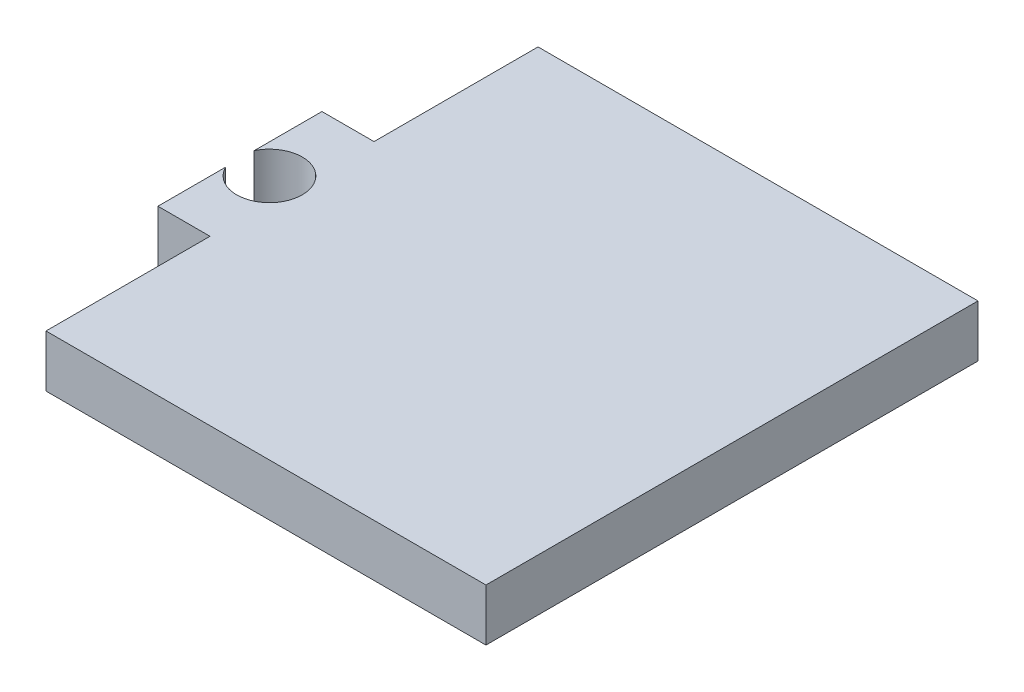
ISO-10303-21;
HEADER;
FILE_DESCRIPTION(('STEP AP214'),'2;1');
FILE_NAME('part.step','',(''),(''),'','','');
FILE_SCHEMA(('AUTOMOTIVE_DESIGN { 1 0 10303 214 1 1 1 1 }'));
ENDSEC;
DATA;
#1=APPLICATION_CONTEXT('core data for automotive mechanical design processes');
#2=APPLICATION_PROTOCOL_DEFINITION('international standard','automotive_design',2000,#1);
#3=PRODUCT_CONTEXT('',#1,'mechanical');
#4=PRODUCT('Part','Part','',(#3));
#5=PRODUCT_RELATED_PRODUCT_CATEGORY('part','',(#4));
#6=PRODUCT_DEFINITION_FORMATION('','',#4);
#7=PRODUCT_DEFINITION_CONTEXT('part definition',#1,'design');
#8=PRODUCT_DEFINITION('design','',#6,#7);
#9=PRODUCT_DEFINITION_SHAPE('','',#8);
#10=(LENGTH_UNIT() NAMED_UNIT(*) SI_UNIT(.MILLI.,.METRE.));
#11=(NAMED_UNIT(*) PLANE_ANGLE_UNIT() SI_UNIT($,.RADIAN.));
#12=(NAMED_UNIT(*) SI_UNIT($,.STERADIAN.) SOLID_ANGLE_UNIT());
#13=UNCERTAINTY_MEASURE_WITH_UNIT(LENGTH_MEASURE(1.E-05),#10,'distance_accuracy_value','');
#14=(GEOMETRIC_REPRESENTATION_CONTEXT(3) GLOBAL_UNCERTAINTY_ASSIGNED_CONTEXT((#13)) GLOBAL_UNIT_ASSIGNED_CONTEXT((#10,
#11,#12)) REPRESENTATION_CONTEXT('',''));
#15=CARTESIAN_POINT('',(0.,0.,0.));
#16=DIRECTION('',(0.,0.,1.));
#17=DIRECTION('',(1.,0.,0.));
#18=AXIS2_PLACEMENT_3D('',#15,#16,#17);
#19=CARTESIAN_POINT('',(3.175,3.175,-30.));
#20=DIRECTION('',(0.,0.,-1.));
#21=DIRECTION('',(-1.,0.,0.));
#22=AXIS2_PLACEMENT_3D('',#19,#20,#21);
#23=PLANE('',#22);
#24=DIRECTION('',(1.,0.,0.));
#25=VECTOR('',#24,1.);
#26=CARTESIAN_POINT('',(3.175,0.,-30.));
#27=LINE('',#26,#25);
#28=CARTESIAN_POINT('',(3.175,0.,-30.));
#29=VERTEX_POINT('',#28);
#30=CARTESIAN_POINT('',(30.,0.,-30.));
#31=VERTEX_POINT('',#30);
#32=EDGE_CURVE('E142',#29,#31,#27,.T.);
#33=ORIENTED_EDGE('',*,*,#32,.F.);
#34=DIRECTION('',(0.,-1.,0.));
#35=VECTOR('',#34,1.);
#36=CARTESIAN_POINT('',(3.175,3.175,-30.));
#37=LINE('',#36,#35);
#38=CARTESIAN_POINT('',(3.175,3.175,-30.));
#39=VERTEX_POINT('',#38);
#40=EDGE_CURVE('E11',#39,#29,#37,.T.);
#41=ORIENTED_EDGE('',*,*,#40,.F.);
#42=DIRECTION('',(1.,0.,0.));
#43=VECTOR('',#42,1.);
#44=CARTESIAN_POINT('',(3.175,3.175,-30.));
#45=LINE('',#44,#43);
#46=CARTESIAN_POINT('',(30.,3.175,-30.));
#47=VERTEX_POINT('',#46);
#48=EDGE_CURVE('E166',#39,#47,#45,.T.);
#49=ORIENTED_EDGE('',*,*,#48,.T.);
#50=DIRECTION('',(0.,-1.,0.));
#51=VECTOR('',#50,1.);
#52=CARTESIAN_POINT('',(30.,3.175,-30.));
#53=LINE('',#52,#51);
#54=EDGE_CURVE('E36',#47,#31,#53,.T.);
#55=ORIENTED_EDGE('',*,*,#54,.T.);
#56=EDGE_LOOP('',(#33,#41,#49,#55));
#57=FACE_BOUND('',#56,.T.);
#58=ADVANCED_FACE('F33',(#57),#23,.T.);
#59=CARTESIAN_POINT('',(3.175,3.175,-30.));
#60=DIRECTION('',(1.,0.,0.));
#61=DIRECTION('',(0.,0.,-1.));
#62=AXIS2_PLACEMENT_3D('',#59,#60,#61);
#63=PLANE('',#62);
#64=DIRECTION('',(0.,0.,1.));
#65=VECTOR('',#64,1.);
#66=CARTESIAN_POINT('',(3.175,0.,-30.));
#67=LINE('',#66,#65);
#68=CARTESIAN_POINT('',(3.175,0.,-20.));
#69=VERTEX_POINT('',#68);
#70=EDGE_CURVE('E165',#29,#69,#67,.T.);
#71=ORIENTED_EDGE('',*,*,#70,.T.);
#72=DIRECTION('',(0.,-1.,0.));
#73=VECTOR('',#72,1.);
#74=CARTESIAN_POINT('',(3.175,3.175,-20.));
#75=LINE('',#74,#73);
#76=CARTESIAN_POINT('',(3.175,3.175,-20.));
#77=VERTEX_POINT('',#76);
#78=EDGE_CURVE('E42',#77,#69,#75,.T.);
#79=ORIENTED_EDGE('',*,*,#78,.F.);
#80=DIRECTION('',(0.,0.,1.));
#81=VECTOR('',#80,1.);
#82=CARTESIAN_POINT('',(3.175,3.175,-30.));
#83=LINE('',#82,#81);
#84=EDGE_CURVE('E132',#39,#77,#83,.T.);
#85=ORIENTED_EDGE('',*,*,#84,.F.);
#86=ORIENTED_EDGE('',*,*,#40,.T.);
#87=EDGE_LOOP('',(#71,#79,#85,#86));
#88=FACE_BOUND('',#87,.T.);
#89=ADVANCED_FACE('F186',(#88),#63,.F.);
#90=CARTESIAN_POINT('',(0.,3.175,-20.));
#91=DIRECTION('',(0.,0.,-1.));
#92=DIRECTION('',(-1.,0.,0.));
#93=AXIS2_PLACEMENT_3D('',#90,#91,#92);
#94=PLANE('',#93);
#95=DIRECTION('',(1.,0.,0.));
#96=VECTOR('',#95,1.);
#97=CARTESIAN_POINT('',(0.,0.,-20.));
#98=LINE('',#97,#96);
#99=CARTESIAN_POINT('',(0.,0.,-20.));
#100=VERTEX_POINT('',#99);
#101=EDGE_CURVE('E120',#100,#69,#98,.T.);
#102=ORIENTED_EDGE('',*,*,#101,.F.);
#103=DIRECTION('',(0.,-1.,0.));
#104=VECTOR('',#103,1.);
#105=CARTESIAN_POINT('',(0.,3.175,-20.));
#106=LINE('',#105,#104);
#107=CARTESIAN_POINT('',(0.,3.175,-20.));
#108=VERTEX_POINT('',#107);
#109=EDGE_CURVE('E115',#108,#100,#106,.T.);
#110=ORIENTED_EDGE('',*,*,#109,.F.);
#111=DIRECTION('',(1.,0.,0.));
#112=VECTOR('',#111,1.);
#113=CARTESIAN_POINT('',(0.,3.175,-20.));
#114=LINE('',#113,#112);
#115=EDGE_CURVE('E118',#108,#77,#114,.T.);
#116=ORIENTED_EDGE('',*,*,#115,.T.);
#117=ORIENTED_EDGE('',*,*,#78,.T.);
#118=EDGE_LOOP('',(#102,#110,#116,#117));
#119=FACE_BOUND('',#118,.T.);
#120=ADVANCED_FACE('F117',(#119),#94,.T.);
#121=CARTESIAN_POINT('',(0.,3.175,-15.8717797887081));
#122=DIRECTION('',(-1.,0.,0.));
#123=DIRECTION('',(0.,0.,1.));
#124=AXIS2_PLACEMENT_3D('',#121,#122,#123);
#125=PLANE('',#124);
#126=DIRECTION('',(0.,0.,-1.));
#127=VECTOR('',#126,1.);
#128=CARTESIAN_POINT('',(0.,0.,-15.8717797887081));
#129=LINE('',#128,#127);
#130=CARTESIAN_POINT('',(0.,0.,-15.8717797887081));
#131=VERTEX_POINT('',#130);
#132=EDGE_CURVE('E162',#131,#100,#129,.T.);
#133=ORIENTED_EDGE('',*,*,#132,.F.);
#134=DIRECTION('',(0.,-1.,0.));
#135=VECTOR('',#134,1.);
#136=CARTESIAN_POINT('',(0.,3.175,-15.8717797887081));
#137=LINE('',#136,#135);
#138=CARTESIAN_POINT('',(0.,3.175,-15.8717797887081));
#139=VERTEX_POINT('',#138);
#140=EDGE_CURVE('E125',#139,#131,#137,.T.);
#141=ORIENTED_EDGE('',*,*,#140,.F.);
#142=DIRECTION('',(0.,0.,-1.));
#143=VECTOR('',#142,1.);
#144=CARTESIAN_POINT('',(0.,3.175,-15.8717797887081));
#145=LINE('',#144,#143);
#146=EDGE_CURVE('E130',#139,#108,#145,.T.);
#147=ORIENTED_EDGE('',*,*,#146,.T.);
#148=ORIENTED_EDGE('',*,*,#109,.T.);
#149=EDGE_LOOP('',(#133,#141,#147,#148));
#150=FACE_BOUND('',#149,.T.);
#151=ADVANCED_FACE('F134',(#150),#125,.T.);
#152=CARTESIAN_POINT('',(1.8,3.175,-15.));
#153=DIRECTION('',(0.,-1.,0.));
#154=DIRECTION('',(0.,0.,-1.));
#155=AXIS2_PLACEMENT_3D('',#152,#153,#154);
#156=CYLINDRICAL_SURFACE('',#155,2.);
#157=CARTESIAN_POINT('',(1.8,0.,-15.));
#158=DIRECTION('',(0.,1.,0.));
#159=DIRECTION('',(0.,0.,1.));
#160=AXIS2_PLACEMENT_3D('',#157,#158,#159);
#161=CIRCLE('',#160,2.);
#162=CARTESIAN_POINT('',(0.,0.,-14.1282202112919));
#163=VERTEX_POINT('',#162);
#164=EDGE_CURVE('E159',#163,#131,#161,.T.);
#165=ORIENTED_EDGE('',*,*,#164,.F.);
#166=DIRECTION('',(0.,-1.,0.));
#167=VECTOR('',#166,1.);
#168=CARTESIAN_POINT('',(0.,3.175,-14.1282202112919));
#169=LINE('',#168,#167);
#170=CARTESIAN_POINT('',(0.,3.175,-14.1282202112919));
#171=VERTEX_POINT('',#170);
#172=EDGE_CURVE('E170',#171,#163,#169,.T.);
#173=ORIENTED_EDGE('',*,*,#172,.F.);
#174=CARTESIAN_POINT('',(1.8,3.175,-15.));
#175=DIRECTION('',(0.,1.,0.));
#176=DIRECTION('',(0.,0.,1.));
#177=AXIS2_PLACEMENT_3D('',#174,#175,#176);
#178=CIRCLE('',#177,2.);
#179=EDGE_CURVE('E135',#171,#139,#178,.T.);
#180=ORIENTED_EDGE('',*,*,#179,.T.);
#181=ORIENTED_EDGE('',*,*,#140,.T.);
#182=EDGE_LOOP('',(#165,#173,#180,#181));
#183=FACE_BOUND('',#182,.T.);
#184=ADVANCED_FACE('F206',(#183),#156,.F.);
#185=CARTESIAN_POINT('',(0.,3.175,-10.));
#186=DIRECTION('',(-1.,0.,0.));
#187=DIRECTION('',(0.,0.,1.));
#188=AXIS2_PLACEMENT_3D('',#185,#186,#187);
#189=PLANE('',#188);
#190=DIRECTION('',(0.,0.,-1.));
#191=VECTOR('',#190,1.);
#192=CARTESIAN_POINT('',(0.,0.,-10.));
#193=LINE('',#192,#191);
#194=CARTESIAN_POINT('',(0.,0.,-10.));
#195=VERTEX_POINT('',#194);
#196=EDGE_CURVE('E156',#195,#163,#193,.T.);
#197=ORIENTED_EDGE('',*,*,#196,.F.);
#198=DIRECTION('',(0.,-1.,0.));
#199=VECTOR('',#198,1.);
#200=CARTESIAN_POINT('',(0.,3.175,-10.));
#201=LINE('',#200,#199);
#202=CARTESIAN_POINT('',(0.,3.175,-10.));
#203=VERTEX_POINT('',#202);
#204=EDGE_CURVE('E172',#203,#195,#201,.T.);
#205=ORIENTED_EDGE('',*,*,#204,.F.);
#206=DIRECTION('',(0.,0.,-1.));
#207=VECTOR('',#206,1.);
#208=CARTESIAN_POINT('',(0.,3.175,-10.));
#209=LINE('',#208,#207);
#210=EDGE_CURVE('E137',#203,#171,#209,.T.);
#211=ORIENTED_EDGE('',*,*,#210,.T.);
#212=ORIENTED_EDGE('',*,*,#172,.T.);
#213=EDGE_LOOP('',(#197,#205,#211,#212));
#214=FACE_BOUND('',#213,.T.);
#215=ADVANCED_FACE('F200',(#214),#189,.T.);
#216=CARTESIAN_POINT('',(0.,3.175,-10.));
#217=DIRECTION('',(0.,0.,-1.));
#218=DIRECTION('',(-1.,0.,0.));
#219=AXIS2_PLACEMENT_3D('',#216,#217,#218);
#220=PLANE('',#219);
#221=DIRECTION('',(1.,0.,0.));
#222=VECTOR('',#221,1.);
#223=CARTESIAN_POINT('',(0.,0.,-10.));
#224=LINE('',#223,#222);
#225=CARTESIAN_POINT('',(3.175,0.,-10.));
#226=VERTEX_POINT('',#225);
#227=EDGE_CURVE('E153',#195,#226,#224,.T.);
#228=ORIENTED_EDGE('',*,*,#227,.T.);
#229=DIRECTION('',(0.,-1.,0.));
#230=VECTOR('',#229,1.);
#231=CARTESIAN_POINT('',(3.175,3.175,-10.));
#232=LINE('',#231,#230);
#233=CARTESIAN_POINT('',(3.175,3.175,-10.));
#234=VERTEX_POINT('',#233);
#235=EDGE_CURVE('E174',#234,#226,#232,.T.);
#236=ORIENTED_EDGE('',*,*,#235,.F.);
#237=DIRECTION('',(1.,0.,0.));
#238=VECTOR('',#237,1.);
#239=CARTESIAN_POINT('',(0.,3.175,-10.));
#240=LINE('',#239,#238);
#241=EDGE_CURVE('E195',#203,#234,#240,.T.);
#242=ORIENTED_EDGE('',*,*,#241,.F.);
#243=ORIENTED_EDGE('',*,*,#204,.T.);
#244=EDGE_LOOP('',(#228,#236,#242,#243));
#245=FACE_BOUND('',#244,.T.);
#246=ADVANCED_FACE('F210',(#245),#220,.F.);
#247=CARTESIAN_POINT('',(3.175,3.175,0.));
#248=DIRECTION('',(-1.,0.,0.));
#249=DIRECTION('',(0.,0.,1.));
#250=AXIS2_PLACEMENT_3D('',#247,#248,#249);
#251=PLANE('',#250);
#252=DIRECTION('',(0.,0.,-1.));
#253=VECTOR('',#252,1.);
#254=CARTESIAN_POINT('',(3.175,0.,0.));
#255=LINE('',#254,#253);
#256=CARTESIAN_POINT('',(3.175,0.,0.));
#257=VERTEX_POINT('',#256);
#258=EDGE_CURVE('E150',#257,#226,#255,.T.);
#259=ORIENTED_EDGE('',*,*,#258,.F.);
#260=DIRECTION('',(0.,-1.,0.));
#261=VECTOR('',#260,1.);
#262=CARTESIAN_POINT('',(3.175,3.175,0.));
#263=LINE('',#262,#261);
#264=CARTESIAN_POINT('',(3.175,3.175,0.));
#265=VERTEX_POINT('',#264);
#266=EDGE_CURVE('E176',#265,#257,#263,.T.);
#267=ORIENTED_EDGE('',*,*,#266,.F.);
#268=DIRECTION('',(0.,0.,-1.));
#269=VECTOR('',#268,1.);
#270=CARTESIAN_POINT('',(3.175,3.175,0.));
#271=LINE('',#270,#269);
#272=EDGE_CURVE('E192',#265,#234,#271,.T.);
#273=ORIENTED_EDGE('',*,*,#272,.T.);
#274=ORIENTED_EDGE('',*,*,#235,.T.);
#275=EDGE_LOOP('',(#259,#267,#273,#274));
#276=FACE_BOUND('',#275,.T.);
#277=ADVANCED_FACE('F212',(#276),#251,.T.);
#278=CARTESIAN_POINT('',(3.175,3.175,0.));
#279=DIRECTION('',(0.,0.,-1.));
#280=DIRECTION('',(-1.,0.,0.));
#281=AXIS2_PLACEMENT_3D('',#278,#279,#280);
#282=PLANE('',#281);
#283=DIRECTION('',(1.,0.,0.));
#284=VECTOR('',#283,1.);
#285=CARTESIAN_POINT('',(3.175,0.,0.));
#286=LINE('',#285,#284);
#287=CARTESIAN_POINT('',(30.,0.,0.));
#288=VERTEX_POINT('',#287);
#289=EDGE_CURVE('E148',#257,#288,#286,.T.);
#290=ORIENTED_EDGE('',*,*,#289,.T.);
#291=DIRECTION('',(0.,-1.,0.));
#292=VECTOR('',#291,1.);
#293=CARTESIAN_POINT('',(30.,3.175,0.));
#294=LINE('',#293,#292);
#295=CARTESIAN_POINT('',(30.,3.175,0.));
#296=VERTEX_POINT('',#295);
#297=EDGE_CURVE('E177',#296,#288,#294,.T.);
#298=ORIENTED_EDGE('',*,*,#297,.F.);
#299=DIRECTION('',(1.,0.,0.));
#300=VECTOR('',#299,1.);
#301=CARTESIAN_POINT('',(3.175,3.175,0.));
#302=LINE('',#301,#300);
#303=EDGE_CURVE('E188',#265,#296,#302,.T.);
#304=ORIENTED_EDGE('',*,*,#303,.F.);
#305=ORIENTED_EDGE('',*,*,#266,.T.);
#306=EDGE_LOOP('',(#290,#298,#304,#305));
#307=FACE_BOUND('',#306,.T.);
#308=ADVANCED_FACE('F215',(#307),#282,.F.);
#309=CARTESIAN_POINT('',(30.,3.175,0.));
#310=DIRECTION('',(-1.,0.,0.));
#311=DIRECTION('',(0.,0.,1.));
#312=AXIS2_PLACEMENT_3D('',#309,#310,#311);
#313=PLANE('',#312);
#314=DIRECTION('',(0.,0.,-1.));
#315=VECTOR('',#314,1.);
#316=CARTESIAN_POINT('',(30.,0.,0.));
#317=LINE('',#316,#315);
#318=EDGE_CURVE('E145',#288,#31,#317,.T.);
#319=ORIENTED_EDGE('',*,*,#318,.T.);
#320=ORIENTED_EDGE('',*,*,#54,.F.);
#321=DIRECTION('',(0.,0.,-1.));
#322=VECTOR('',#321,1.);
#323=CARTESIAN_POINT('',(30.,3.175,0.));
#324=LINE('',#323,#322);
#325=EDGE_CURVE('E96',#296,#47,#324,.T.);
#326=ORIENTED_EDGE('',*,*,#325,.F.);
#327=ORIENTED_EDGE('',*,*,#297,.T.);
#328=EDGE_LOOP('',(#319,#320,#326,#327));
#329=FACE_BOUND('',#328,.T.);
#330=ADVANCED_FACE('F182',(#329),#313,.F.);
#331=CARTESIAN_POINT('',(1.8,3.175,-15.));
#332=DIRECTION('',(0.,1.,0.));
#333=DIRECTION('',(0.,0.,1.));
#334=AXIS2_PLACEMENT_3D('',#331,#332,#333);
#335=PLANE('',#334);
#336=ORIENTED_EDGE('',*,*,#48,.F.);
#337=ORIENTED_EDGE('',*,*,#84,.T.);
#338=ORIENTED_EDGE('',*,*,#115,.F.);
#339=ORIENTED_EDGE('',*,*,#146,.F.);
#340=ORIENTED_EDGE('',*,*,#179,.F.);
#341=ORIENTED_EDGE('',*,*,#210,.F.);
#342=ORIENTED_EDGE('',*,*,#241,.T.);
#343=ORIENTED_EDGE('',*,*,#272,.F.);
#344=ORIENTED_EDGE('',*,*,#303,.T.);
#345=ORIENTED_EDGE('',*,*,#325,.T.);
#346=EDGE_LOOP('',(#336,#337,#338,#339,#340,#341,#342,#343,#344,#345));
#347=FACE_BOUND('',#346,.T.);
#348=ADVANCED_FACE('F128',(#347),#335,.T.);
#349=CARTESIAN_POINT('',(1.8,0.,-15.));
#350=DIRECTION('',(0.,1.,0.));
#351=DIRECTION('',(0.,0.,1.));
#352=AXIS2_PLACEMENT_3D('',#349,#350,#351);
#353=PLANE('',#352);
#354=ORIENTED_EDGE('',*,*,#32,.T.);
#355=ORIENTED_EDGE('',*,*,#318,.F.);
#356=ORIENTED_EDGE('',*,*,#289,.F.);
#357=ORIENTED_EDGE('',*,*,#258,.T.);
#358=ORIENTED_EDGE('',*,*,#227,.F.);
#359=ORIENTED_EDGE('',*,*,#196,.T.);
#360=ORIENTED_EDGE('',*,*,#164,.T.);
#361=ORIENTED_EDGE('',*,*,#132,.T.);
#362=ORIENTED_EDGE('',*,*,#101,.T.);
#363=ORIENTED_EDGE('',*,*,#70,.F.);
#364=EDGE_LOOP('',(#354,#355,#356,#357,#358,#359,#360,#361,#362,#363));
#365=FACE_BOUND('',#364,.T.);
#366=ADVANCED_FACE('F185',(#365),#353,.F.);
#367=CLOSED_SHELL('',(#58,#89,#120,#151,#184,#215,#246,#277,#308,#330,#348,#366));
#368=MANIFOLD_SOLID_BREP('B2',#367);
#369=ADVANCED_BREP_SHAPE_REPRESENTATION('',(#18,#368),#14);
#370=SHAPE_DEFINITION_REPRESENTATION(#9,#369);
ENDSEC;
END-ISO-10303-21;
